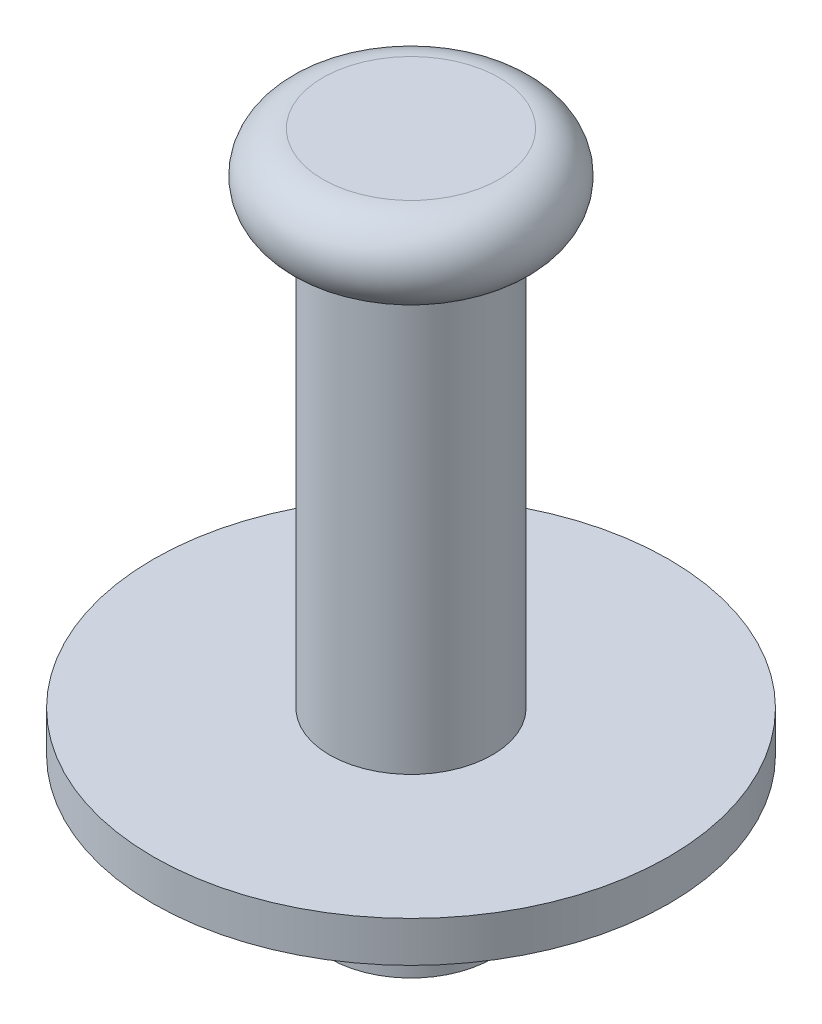
ISO-10303-21;
HEADER;
FILE_DESCRIPTION(('STEP AP214'),'2;1');
FILE_NAME('part.step','',(''),(''),'','','');
FILE_SCHEMA(('AUTOMOTIVE_DESIGN { 1 0 10303 214 1 1 1 1 }'));
ENDSEC;
DATA;
#1=APPLICATION_CONTEXT('core data for automotive mechanical design processes');
#2=APPLICATION_PROTOCOL_DEFINITION('international standard','automotive_design',2000,#1);
#3=PRODUCT_CONTEXT('',#1,'mechanical');
#4=PRODUCT('Part','Part','',(#3));
#5=PRODUCT_RELATED_PRODUCT_CATEGORY('part','',(#4));
#6=PRODUCT_DEFINITION_FORMATION('','',#4);
#7=PRODUCT_DEFINITION_CONTEXT('part definition',#1,'design');
#8=PRODUCT_DEFINITION('design','',#6,#7);
#9=PRODUCT_DEFINITION_SHAPE('','',#8);
#10=(LENGTH_UNIT() NAMED_UNIT(*) SI_UNIT(.MILLI.,.METRE.));
#11=(NAMED_UNIT(*) PLANE_ANGLE_UNIT() SI_UNIT($,.RADIAN.));
#12=(NAMED_UNIT(*) SI_UNIT($,.STERADIAN.) SOLID_ANGLE_UNIT());
#13=UNCERTAINTY_MEASURE_WITH_UNIT(LENGTH_MEASURE(1.E-05),#10,'distance_accuracy_value','');
#14=(GEOMETRIC_REPRESENTATION_CONTEXT(3) GLOBAL_UNCERTAINTY_ASSIGNED_CONTEXT((#13)) GLOBAL_UNIT_ASSIGNED_CONTEXT((#10,
#11,#12)) REPRESENTATION_CONTEXT('',''));
#15=CARTESIAN_POINT('',(0.,0.,0.));
#16=DIRECTION('',(0.,0.,1.));
#17=DIRECTION('',(1.,0.,0.));
#18=AXIS2_PLACEMENT_3D('',#15,#16,#17);
#19=CARTESIAN_POINT('',(3.,-9.69218608997553,0.));
#20=DIRECTION('',(0.,1.,0.));
#21=DIRECTION('',(0.,0.,1.));
#22=AXIS2_PLACEMENT_3D('',#19,#20,#21);
#23=PLANE('',#22);
#24=CARTESIAN_POINT('',(0.,-9.69218608997554,0.));
#25=DIRECTION('',(0.,1.,0.));
#26=DIRECTION('',(0.,0.,1.));
#27=AXIS2_PLACEMENT_3D('',#24,#25,#26);
#28=CIRCLE('',#27,3.);
#29=CARTESIAN_POINT('',(0.,-9.69218608997554,3.));
#30=VERTEX_POINT('',#29);
#31=EDGE_CURVE('E10',#30,#30,#28,.T.);
#32=ORIENTED_EDGE('',*,*,#31,.F.);
#33=EDGE_LOOP('',(#32));
#34=FACE_BOUND('',#33,.T.);
#35=ADVANCED_FACE('F33',(#34),#23,.F.);
#36=CARTESIAN_POINT('',(0.,15.6739811912226,0.));
#37=DIRECTION('',(0.,1.,0.));
#38=DIRECTION('',(0.,0.,1.));
#39=AXIS2_PLACEMENT_3D('',#36,#37,#38);
#40=CYLINDRICAL_SURFACE('',#39,3.);
#41=CARTESIAN_POINT('',(0.,-4.69218608997553,0.));
#42=DIRECTION('',(0.,1.,0.));
#43=DIRECTION('',(0.,0.,1.));
#44=AXIS2_PLACEMENT_3D('',#41,#42,#43);
#45=CIRCLE('',#44,3.);
#46=CARTESIAN_POINT('',(0.,-4.69218608997553,3.));
#47=VERTEX_POINT('',#46);
#48=EDGE_CURVE('E39',#47,#47,#45,.T.);
#49=ORIENTED_EDGE('',*,*,#48,.F.);
#50=EDGE_LOOP('',(#49));
#51=FACE_BOUND('',#50,.T.);
#52=ORIENTED_EDGE('',*,*,#31,.T.);
#53=EDGE_LOOP('',(#52));
#54=FACE_BOUND('',#53,.T.);
#55=ADVANCED_FACE('F99',(#51,#54),#40,.T.);
#56=CARTESIAN_POINT('',(9.50000000000001,-4.69218608997553,0.));
#57=DIRECTION('',(0.,1.,0.));
#58=DIRECTION('',(0.,0.,1.));
#59=AXIS2_PLACEMENT_3D('',#56,#57,#58);
#60=PLANE('',#59);
#61=CARTESIAN_POINT('',(0.,-4.69218608997553,0.));
#62=DIRECTION('',(0.,1.,0.));
#63=DIRECTION('',(0.,0.,1.));
#64=AXIS2_PLACEMENT_3D('',#61,#62,#63);
#65=CIRCLE('',#64,9.50000000000001);
#66=CARTESIAN_POINT('',(0.,-4.69218608997553,9.50000000000001));
#67=VERTEX_POINT('',#66);
#68=EDGE_CURVE('E43',#67,#67,#65,.T.);
#69=ORIENTED_EDGE('',*,*,#68,.F.);
#70=EDGE_LOOP('',(#69));
#71=FACE_BOUND('',#70,.T.);
#72=ORIENTED_EDGE('',*,*,#48,.T.);
#73=EDGE_LOOP('',(#72));
#74=FACE_BOUND('',#73,.T.);
#75=ADVANCED_FACE('F94',(#71,#74),#60,.F.);
#76=CARTESIAN_POINT('',(0.,15.6739811912226,0.));
#77=DIRECTION('',(0.,1.,0.));
#78=DIRECTION('',(0.,0.,1.));
#79=AXIS2_PLACEMENT_3D('',#76,#77,#78);
#80=CYLINDRICAL_SURFACE('',#79,9.50000000000001);
#81=CARTESIAN_POINT('',(0.,-3.19218608997553,0.));
#82=DIRECTION('',(0.,1.,0.));
#83=DIRECTION('',(0.,0.,1.));
#84=AXIS2_PLACEMENT_3D('',#81,#82,#83);
#85=CIRCLE('',#84,9.50000000000001);
#86=CARTESIAN_POINT('',(0.,-3.19218608997553,9.50000000000001));
#87=VERTEX_POINT('',#86);
#88=EDGE_CURVE('E47',#87,#87,#85,.T.);
#89=ORIENTED_EDGE('',*,*,#88,.F.);
#90=EDGE_LOOP('',(#89));
#91=FACE_BOUND('',#90,.T.);
#92=ORIENTED_EDGE('',*,*,#68,.T.);
#93=EDGE_LOOP('',(#92));
#94=FACE_BOUND('',#93,.T.);
#95=ADVANCED_FACE('F88',(#91,#94),#80,.T.);
#96=CARTESIAN_POINT('',(3.,-3.19218608997553,0.));
#97=DIRECTION('',(0.,-1.,0.));
#98=DIRECTION('',(0.,0.,-1.));
#99=AXIS2_PLACEMENT_3D('',#96,#97,#98);
#100=PLANE('',#99);
#101=CARTESIAN_POINT('',(0.,-3.19218608997553,0.));
#102=DIRECTION('',(0.,1.,0.));
#103=DIRECTION('',(0.,0.,1.));
#104=AXIS2_PLACEMENT_3D('',#101,#102,#103);
#105=CIRCLE('',#104,3.);
#106=CARTESIAN_POINT('',(0.,-3.19218608997553,3.));
#107=VERTEX_POINT('',#106);
#108=EDGE_CURVE('E52',#107,#107,#105,.T.);
#109=ORIENTED_EDGE('',*,*,#108,.F.);
#110=EDGE_LOOP('',(#109));
#111=FACE_BOUND('',#110,.T.);
#112=ORIENTED_EDGE('',*,*,#88,.T.);
#113=EDGE_LOOP('',(#112));
#114=FACE_BOUND('',#113,.T.);
#115=ADVANCED_FACE('F82',(#111,#114),#100,.F.);
#116=CARTESIAN_POINT('',(0.,15.6739811912226,0.));
#117=DIRECTION('',(0.,1.,0.));
#118=DIRECTION('',(0.,0.,1.));
#119=AXIS2_PLACEMENT_3D('',#116,#117,#118);
#120=CYLINDRICAL_SURFACE('',#119,3.);
#121=CARTESIAN_POINT('',(0.,12.3078139100245,0.));
#122=DIRECTION('',(0.,1.,0.));
#123=DIRECTION('',(0.,0.,1.));
#124=AXIS2_PLACEMENT_3D('',#121,#122,#123);
#125=CIRCLE('',#124,3.);
#126=CARTESIAN_POINT('',(0.,12.3078139100245,3.));
#127=VERTEX_POINT('',#126);
#128=EDGE_CURVE('E55',#127,#127,#125,.T.);
#129=ORIENTED_EDGE('',*,*,#128,.F.);
#130=EDGE_LOOP('',(#129));
#131=FACE_BOUND('',#130,.T.);
#132=ORIENTED_EDGE('',*,*,#108,.T.);
#133=EDGE_LOOP('',(#132));
#134=FACE_BOUND('',#133,.T.);
#135=ADVANCED_FACE('F76',(#131,#134),#120,.T.);
#136=CARTESIAN_POINT('',(3.25,12.3078139100245,0.));
#137=DIRECTION('',(0.,1.,0.));
#138=DIRECTION('',(0.,0.,1.));
#139=AXIS2_PLACEMENT_3D('',#136,#137,#138);
#140=PLANE('',#139);
#141=CARTESIAN_POINT('',(0.,12.3078139100245,0.));
#142=DIRECTION('',(0.,1.,0.));
#143=DIRECTION('',(0.,0.,1.));
#144=AXIS2_PLACEMENT_3D('',#141,#142,#143);
#145=CIRCLE('',#144,3.25);
#146=CARTESIAN_POINT('',(0.,12.3078139100245,3.25));
#147=VERTEX_POINT('',#146);
#148=EDGE_CURVE('E58',#147,#147,#145,.T.);
#149=ORIENTED_EDGE('',*,*,#148,.F.);
#150=EDGE_LOOP('',(#149));
#151=FACE_BOUND('',#150,.T.);
#152=ORIENTED_EDGE('',*,*,#128,.T.);
#153=EDGE_LOOP('',(#152));
#154=FACE_BOUND('',#153,.T.);
#155=ADVANCED_FACE('F70',(#151,#154),#140,.F.);
#156=CARTESIAN_POINT('',(0.,13.8078139100245,0.));
#157=DIRECTION('',(0.,1.,0.));
#158=DIRECTION('',(0.,0.,1.));
#159=AXIS2_PLACEMENT_3D('',#156,#157,#158);
#160=TOROIDAL_SURFACE('',#159,3.25,1.5);
#161=CARTESIAN_POINT('',(0.,15.3078139100245,0.));
#162=DIRECTION('',(0.,1.,0.));
#163=DIRECTION('',(0.,0.,1.));
#164=AXIS2_PLACEMENT_3D('',#161,#162,#163);
#165=CIRCLE('',#164,3.25);
#166=CARTESIAN_POINT('',(0.,15.3078139100245,3.25));
#167=VERTEX_POINT('',#166);
#168=EDGE_CURVE('E61',#167,#167,#165,.T.);
#169=ORIENTED_EDGE('',*,*,#168,.F.);
#170=EDGE_LOOP('',(#169));
#171=FACE_BOUND('',#170,.T.);
#172=ORIENTED_EDGE('',*,*,#148,.T.);
#173=EDGE_LOOP('',(#172));
#174=FACE_BOUND('',#173,.T.);
#175=ADVANCED_FACE('F67',(#171,#174),#160,.T.);
#176=CARTESIAN_POINT('',(0.,15.3078139100245,0.));
#177=DIRECTION('',(0.,-1.,0.));
#178=DIRECTION('',(0.,0.,-1.));
#179=AXIS2_PLACEMENT_3D('',#176,#177,#178);
#180=PLANE('',#179);
#181=ORIENTED_EDGE('',*,*,#168,.T.);
#182=EDGE_LOOP('',(#181));
#183=FACE_BOUND('',#182,.T.);
#184=ADVANCED_FACE('F65',(#183),#180,.F.);
#185=CLOSED_SHELL('',(#35,#55,#75,#95,#115,#135,#155,#175,#184));
#186=MANIFOLD_SOLID_BREP('B2',#185);
#187=ADVANCED_BREP_SHAPE_REPRESENTATION('',(#18,#186),#14);
#188=SHAPE_DEFINITION_REPRESENTATION(#9,#187);
ENDSEC;
END-ISO-10303-21;
